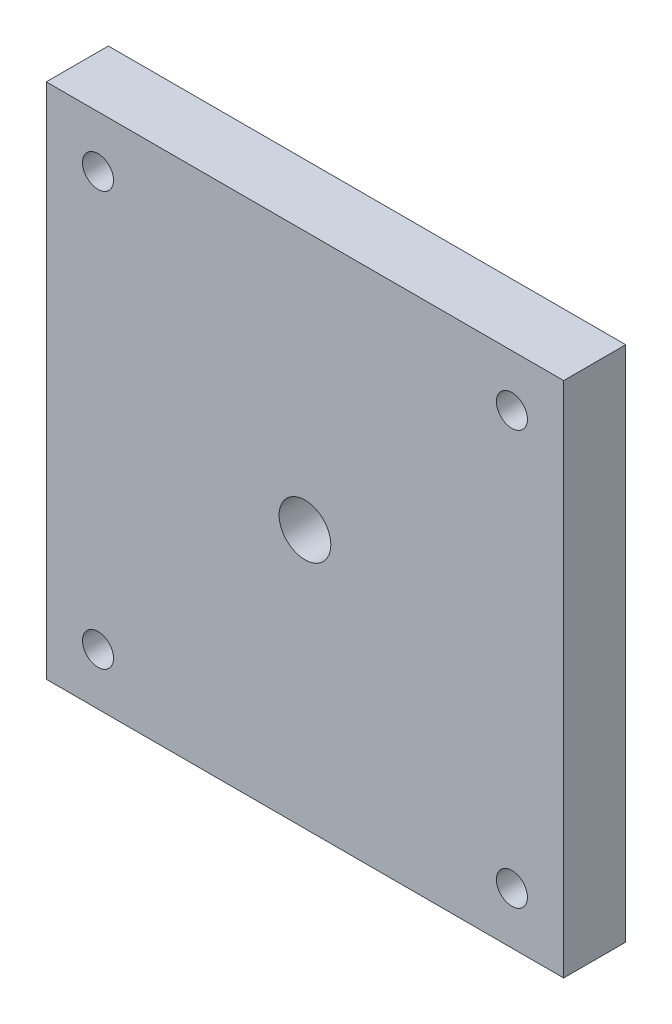
ISO-10303-21;
HEADER;
FILE_DESCRIPTION(('STEP AP214'),'2;1');
FILE_NAME('part.step','',(''),(''),'','','');
FILE_SCHEMA(('AUTOMOTIVE_DESIGN { 1 0 10303 214 1 1 1 1 }'));
ENDSEC;
DATA;
#1=APPLICATION_CONTEXT('core data for automotive mechanical design processes');
#2=APPLICATION_PROTOCOL_DEFINITION('international standard','automotive_design',2000,#1);
#3=PRODUCT_CONTEXT('',#1,'mechanical');
#4=PRODUCT('Part','Part','',(#3));
#5=PRODUCT_RELATED_PRODUCT_CATEGORY('part','',(#4));
#6=PRODUCT_DEFINITION_FORMATION('','',#4);
#7=PRODUCT_DEFINITION_CONTEXT('part definition',#1,'design');
#8=PRODUCT_DEFINITION('design','',#6,#7);
#9=PRODUCT_DEFINITION_SHAPE('','',#8);
#10=(LENGTH_UNIT() NAMED_UNIT(*) SI_UNIT(.MILLI.,.METRE.));
#11=(NAMED_UNIT(*) PLANE_ANGLE_UNIT() SI_UNIT($,.RADIAN.));
#12=(NAMED_UNIT(*) SI_UNIT($,.STERADIAN.) SOLID_ANGLE_UNIT());
#13=UNCERTAINTY_MEASURE_WITH_UNIT(LENGTH_MEASURE(1.E-05),#10,'distance_accuracy_value','');
#14=(GEOMETRIC_REPRESENTATION_CONTEXT(3) GLOBAL_UNCERTAINTY_ASSIGNED_CONTEXT((#13)) GLOBAL_UNIT_ASSIGNED_CONTEXT((#10,
#11,#12)) REPRESENTATION_CONTEXT('',''));
#15=CARTESIAN_POINT('',(0.,0.,0.));
#16=DIRECTION('',(0.,0.,1.));
#17=DIRECTION('',(1.,0.,0.));
#18=AXIS2_PLACEMENT_3D('',#15,#16,#17);
#19=CARTESIAN_POINT('',(0.,0.,6.));
#20=DIRECTION('',(0.,0.,1.));
#21=DIRECTION('',(1.,0.,0.));
#22=AXIS2_PLACEMENT_3D('',#19,#20,#21);
#23=PLANE('',#22);
#24=CARTESIAN_POINT('',(20.,-20.,6.));
#25=DIRECTION('',(0.,0.,1.));
#26=DIRECTION('',(1.,0.,0.));
#27=AXIS2_PLACEMENT_3D('',#24,#25,#26);
#28=CIRCLE('',#27,1.5);
#29=CARTESIAN_POINT('',(21.5,-20.,6.));
#30=VERTEX_POINT('',#29);
#31=EDGE_CURVE('E128',#30,#30,#28,.T.);
#32=ORIENTED_EDGE('',*,*,#31,.F.);
#33=EDGE_LOOP('',(#32));
#34=FACE_BOUND('',#33,.T.);
#35=CARTESIAN_POINT('',(-20.,20.,6.));
#36=DIRECTION('',(0.,0.,1.));
#37=DIRECTION('',(1.,0.,0.));
#38=AXIS2_PLACEMENT_3D('',#35,#36,#37);
#39=CIRCLE('',#38,1.5);
#40=CARTESIAN_POINT('',(-18.5,20.,6.));
#41=VERTEX_POINT('',#40);
#42=EDGE_CURVE('E116',#41,#41,#39,.T.);
#43=ORIENTED_EDGE('',*,*,#42,.F.);
#44=EDGE_LOOP('',(#43));
#45=FACE_BOUND('',#44,.T.);
#46=DIRECTION('',(0.,-1.,0.));
#47=VECTOR('',#46,1.);
#48=CARTESIAN_POINT('',(-25.,25.,6.));
#49=LINE('',#48,#47);
#50=CARTESIAN_POINT('',(-25.,25.,6.));
#51=VERTEX_POINT('',#50);
#52=CARTESIAN_POINT('',(-25.,-25.,6.));
#53=VERTEX_POINT('',#52);
#54=EDGE_CURVE('E86',#51,#53,#49,.T.);
#55=ORIENTED_EDGE('',*,*,#54,.T.);
#56=DIRECTION('',(1.,0.,0.));
#57=VECTOR('',#56,1.);
#58=CARTESIAN_POINT('',(-25.,-25.,6.));
#59=LINE('',#58,#57);
#60=CARTESIAN_POINT('',(25.,-25.,6.));
#61=VERTEX_POINT('',#60);
#62=EDGE_CURVE('E81',#53,#61,#59,.T.);
#63=ORIENTED_EDGE('',*,*,#62,.T.);
#64=DIRECTION('',(0.,1.,0.));
#65=VECTOR('',#64,1.);
#66=CARTESIAN_POINT('',(25.,25.,6.));
#67=LINE('',#66,#65);
#68=CARTESIAN_POINT('',(25.,25.,6.));
#69=VERTEX_POINT('',#68);
#70=EDGE_CURVE('E84',#61,#69,#67,.T.);
#71=ORIENTED_EDGE('',*,*,#70,.T.);
#72=DIRECTION('',(-1.,0.,0.));
#73=VECTOR('',#72,1.);
#74=CARTESIAN_POINT('',(-25.,25.,6.));
#75=LINE('',#74,#73);
#76=EDGE_CURVE('E51',#69,#51,#75,.T.);
#77=ORIENTED_EDGE('',*,*,#76,.T.);
#78=EDGE_LOOP('',(#55,#63,#71,#77));
#79=FACE_BOUND('',#78,.T.);
#80=CARTESIAN_POINT('',(0.,0.,6.));
#81=DIRECTION('',(0.,0.,1.));
#82=DIRECTION('',(1.,0.,0.));
#83=AXIS2_PLACEMENT_3D('',#80,#81,#82);
#84=CIRCLE('',#83,2.5);
#85=CARTESIAN_POINT('',(2.5,0.,6.));
#86=VERTEX_POINT('',#85);
#87=EDGE_CURVE('E101',#86,#86,#84,.T.);
#88=ORIENTED_EDGE('',*,*,#87,.F.);
#89=EDGE_LOOP('',(#88));
#90=FACE_BOUND('',#89,.T.);
#91=CARTESIAN_POINT('',(20.,20.,6.));
#92=DIRECTION('',(0.,0.,1.));
#93=DIRECTION('',(-1.,0.,0.));
#94=AXIS2_PLACEMENT_3D('',#91,#92,#93);
#95=CIRCLE('',#94,1.5);
#96=CARTESIAN_POINT('',(18.5,20.,6.));
#97=VERTEX_POINT('',#96);
#98=EDGE_CURVE('E122',#97,#97,#95,.T.);
#99=ORIENTED_EDGE('',*,*,#98,.F.);
#100=EDGE_LOOP('',(#99));
#101=FACE_BOUND('',#100,.T.);
#102=CARTESIAN_POINT('',(-20.,-20.,6.));
#103=DIRECTION('',(0.,0.,1.));
#104=DIRECTION('',(-1.,0.,0.));
#105=AXIS2_PLACEMENT_3D('',#102,#103,#104);
#106=CIRCLE('',#105,1.5);
#107=CARTESIAN_POINT('',(-21.5,-20.,6.));
#108=VERTEX_POINT('',#107);
#109=EDGE_CURVE('E134',#108,#108,#106,.T.);
#110=ORIENTED_EDGE('',*,*,#109,.F.);
#111=EDGE_LOOP('',(#110));
#112=FACE_BOUND('',#111,.T.);
#113=ADVANCED_FACE('F34',(#34,#45,#79,#90,#101,#112),#23,.T.);
#114=CARTESIAN_POINT('',(0.,0.,0.));
#115=DIRECTION('',(0.,0.,1.));
#116=DIRECTION('',(1.,0.,0.));
#117=AXIS2_PLACEMENT_3D('',#114,#115,#116);
#118=PLANE('',#117);
#119=CARTESIAN_POINT('',(20.,-20.,0.));
#120=DIRECTION('',(0.,0.,1.));
#121=DIRECTION('',(1.,0.,0.));
#122=AXIS2_PLACEMENT_3D('',#119,#120,#121);
#123=CIRCLE('',#122,1.5);
#124=CARTESIAN_POINT('',(21.5,-20.,0.));
#125=VERTEX_POINT('',#124);
#126=EDGE_CURVE('E131',#125,#125,#123,.T.);
#127=ORIENTED_EDGE('',*,*,#126,.T.);
#128=EDGE_LOOP('',(#127));
#129=FACE_BOUND('',#128,.T.);
#130=CARTESIAN_POINT('',(-20.,20.,0.));
#131=DIRECTION('',(0.,0.,1.));
#132=DIRECTION('',(1.,0.,0.));
#133=AXIS2_PLACEMENT_3D('',#130,#131,#132);
#134=CIRCLE('',#133,1.5);
#135=CARTESIAN_POINT('',(-18.5,20.,0.));
#136=VERTEX_POINT('',#135);
#137=EDGE_CURVE('E119',#136,#136,#134,.T.);
#138=ORIENTED_EDGE('',*,*,#137,.T.);
#139=EDGE_LOOP('',(#138));
#140=FACE_BOUND('',#139,.T.);
#141=DIRECTION('',(0.,-1.,0.));
#142=VECTOR('',#141,1.);
#143=CARTESIAN_POINT('',(-25.,25.,0.));
#144=LINE('',#143,#142);
#145=CARTESIAN_POINT('',(-25.,25.,0.));
#146=VERTEX_POINT('',#145);
#147=CARTESIAN_POINT('',(-25.,-25.,0.));
#148=VERTEX_POINT('',#147);
#149=EDGE_CURVE('E98',#146,#148,#144,.T.);
#150=ORIENTED_EDGE('',*,*,#149,.F.);
#151=DIRECTION('',(-1.,0.,0.));
#152=VECTOR('',#151,1.);
#153=CARTESIAN_POINT('',(-25.,25.,0.));
#154=LINE('',#153,#152);
#155=CARTESIAN_POINT('',(25.,25.,0.));
#156=VERTEX_POINT('',#155);
#157=EDGE_CURVE('E74',#156,#146,#154,.T.);
#158=ORIENTED_EDGE('',*,*,#157,.F.);
#159=DIRECTION('',(0.,1.,0.));
#160=VECTOR('',#159,1.);
#161=CARTESIAN_POINT('',(25.,25.,0.));
#162=LINE('',#161,#160);
#163=CARTESIAN_POINT('',(25.,-25.,0.));
#164=VERTEX_POINT('',#163);
#165=EDGE_CURVE('E68',#164,#156,#162,.T.);
#166=ORIENTED_EDGE('',*,*,#165,.F.);
#167=DIRECTION('',(1.,0.,0.));
#168=VECTOR('',#167,1.);
#169=CARTESIAN_POINT('',(-25.,-25.,0.));
#170=LINE('',#169,#168);
#171=EDGE_CURVE('E90',#148,#164,#170,.T.);
#172=ORIENTED_EDGE('',*,*,#171,.F.);
#173=EDGE_LOOP('',(#150,#158,#166,#172));
#174=FACE_BOUND('',#173,.T.);
#175=CARTESIAN_POINT('',(0.,0.,0.));
#176=DIRECTION('',(0.,0.,1.));
#177=DIRECTION('',(1.,0.,0.));
#178=AXIS2_PLACEMENT_3D('',#175,#176,#177);
#179=CIRCLE('',#178,2.5);
#180=CARTESIAN_POINT('',(2.5,0.,0.));
#181=VERTEX_POINT('',#180);
#182=EDGE_CURVE('E113',#181,#181,#179,.T.);
#183=ORIENTED_EDGE('',*,*,#182,.T.);
#184=EDGE_LOOP('',(#183));
#185=FACE_BOUND('',#184,.T.);
#186=CARTESIAN_POINT('',(20.,20.,0.));
#187=DIRECTION('',(0.,0.,1.));
#188=DIRECTION('',(-1.,0.,0.));
#189=AXIS2_PLACEMENT_3D('',#186,#187,#188);
#190=CIRCLE('',#189,1.5);
#191=CARTESIAN_POINT('',(18.5,20.,0.));
#192=VERTEX_POINT('',#191);
#193=EDGE_CURVE('E125',#192,#192,#190,.T.);
#194=ORIENTED_EDGE('',*,*,#193,.T.);
#195=EDGE_LOOP('',(#194));
#196=FACE_BOUND('',#195,.T.);
#197=CARTESIAN_POINT('',(-20.,-20.,0.));
#198=DIRECTION('',(0.,0.,1.));
#199=DIRECTION('',(-1.,0.,0.));
#200=AXIS2_PLACEMENT_3D('',#197,#198,#199);
#201=CIRCLE('',#200,1.5);
#202=CARTESIAN_POINT('',(-21.5,-20.,0.));
#203=VERTEX_POINT('',#202);
#204=EDGE_CURVE('E137',#203,#203,#201,.T.);
#205=ORIENTED_EDGE('',*,*,#204,.T.);
#206=EDGE_LOOP('',(#205));
#207=FACE_BOUND('',#206,.T.);
#208=ADVANCED_FACE('F109',(#129,#140,#174,#185,#196,#207),#118,.F.);
#209=CARTESIAN_POINT('',(-25.,25.,6.));
#210=DIRECTION('',(1.,0.,0.));
#211=DIRECTION('',(0.,1.,0.));
#212=AXIS2_PLACEMENT_3D('',#209,#210,#211);
#213=PLANE('',#212);
#214=ORIENTED_EDGE('',*,*,#149,.T.);
#215=DIRECTION('',(0.,0.,-1.));
#216=VECTOR('',#215,1.);
#217=CARTESIAN_POINT('',(-25.,-25.,6.));
#218=LINE('',#217,#216);
#219=EDGE_CURVE('E11',#53,#148,#218,.T.);
#220=ORIENTED_EDGE('',*,*,#219,.F.);
#221=ORIENTED_EDGE('',*,*,#54,.F.);
#222=DIRECTION('',(0.,0.,-1.));
#223=VECTOR('',#222,1.);
#224=CARTESIAN_POINT('',(-25.,25.,6.));
#225=LINE('',#224,#223);
#226=EDGE_CURVE('E94',#51,#146,#225,.T.);
#227=ORIENTED_EDGE('',*,*,#226,.T.);
#228=EDGE_LOOP('',(#214,#220,#221,#227));
#229=FACE_BOUND('',#228,.T.);
#230=ADVANCED_FACE('F36',(#229),#213,.F.);
#231=CARTESIAN_POINT('',(-25.,-25.,6.));
#232=DIRECTION('',(0.,1.,0.));
#233=DIRECTION('',(0.,0.,1.));
#234=AXIS2_PLACEMENT_3D('',#231,#232,#233);
#235=PLANE('',#234);
#236=ORIENTED_EDGE('',*,*,#171,.T.);
#237=DIRECTION('',(0.,0.,-1.));
#238=VECTOR('',#237,1.);
#239=CARTESIAN_POINT('',(25.,-25.,6.));
#240=LINE('',#239,#238);
#241=EDGE_CURVE('E43',#61,#164,#240,.T.);
#242=ORIENTED_EDGE('',*,*,#241,.F.);
#243=ORIENTED_EDGE('',*,*,#62,.F.);
#244=ORIENTED_EDGE('',*,*,#219,.T.);
#245=EDGE_LOOP('',(#236,#242,#243,#244));
#246=FACE_BOUND('',#245,.T.);
#247=ADVANCED_FACE('F89',(#246),#235,.F.);
#248=CARTESIAN_POINT('',(25.,25.,6.));
#249=DIRECTION('',(-1.,0.,0.));
#250=DIRECTION('',(0.,-1.,0.));
#251=AXIS2_PLACEMENT_3D('',#248,#249,#250);
#252=PLANE('',#251);
#253=ORIENTED_EDGE('',*,*,#165,.T.);
#254=DIRECTION('',(0.,0.,-1.));
#255=VECTOR('',#254,1.);
#256=CARTESIAN_POINT('',(25.,25.,6.));
#257=LINE('',#256,#255);
#258=EDGE_CURVE('E91',#69,#156,#257,.T.);
#259=ORIENTED_EDGE('',*,*,#258,.F.);
#260=ORIENTED_EDGE('',*,*,#70,.F.);
#261=ORIENTED_EDGE('',*,*,#241,.T.);
#262=EDGE_LOOP('',(#253,#259,#260,#261));
#263=FACE_BOUND('',#262,.T.);
#264=ADVANCED_FACE('F92',(#263),#252,.F.);
#265=CARTESIAN_POINT('',(-25.,25.,6.));
#266=DIRECTION('',(0.,-1.,0.));
#267=DIRECTION('',(0.,0.,-1.));
#268=AXIS2_PLACEMENT_3D('',#265,#266,#267);
#269=PLANE('',#268);
#270=ORIENTED_EDGE('',*,*,#157,.T.);
#271=ORIENTED_EDGE('',*,*,#226,.F.);
#272=ORIENTED_EDGE('',*,*,#76,.F.);
#273=ORIENTED_EDGE('',*,*,#258,.T.);
#274=EDGE_LOOP('',(#270,#271,#272,#273));
#275=FACE_BOUND('',#274,.T.);
#276=ADVANCED_FACE('F106',(#275),#269,.F.);
#277=CARTESIAN_POINT('',(0.,0.,6.));
#278=DIRECTION('',(0.,0.,-1.));
#279=DIRECTION('',(-1.,0.,0.));
#280=AXIS2_PLACEMENT_3D('',#277,#278,#279);
#281=CYLINDRICAL_SURFACE('',#280,2.5);
#282=ORIENTED_EDGE('',*,*,#87,.T.);
#283=EDGE_LOOP('',(#282));
#284=FACE_BOUND('',#283,.T.);
#285=ORIENTED_EDGE('',*,*,#182,.F.);
#286=EDGE_LOOP('',(#285));
#287=FACE_BOUND('',#286,.T.);
#288=ADVANCED_FACE('F157',(#284,#287),#281,.F.);
#289=CARTESIAN_POINT('',(-20.,20.,6.));
#290=DIRECTION('',(0.,0.,-1.));
#291=DIRECTION('',(-1.,0.,0.));
#292=AXIS2_PLACEMENT_3D('',#289,#290,#291);
#293=CYLINDRICAL_SURFACE('',#292,1.5);
#294=ORIENTED_EDGE('',*,*,#42,.T.);
#295=EDGE_LOOP('',(#294));
#296=FACE_BOUND('',#295,.T.);
#297=ORIENTED_EDGE('',*,*,#137,.F.);
#298=EDGE_LOOP('',(#297));
#299=FACE_BOUND('',#298,.T.);
#300=ADVANCED_FACE('F203',(#296,#299),#293,.F.);
#301=CARTESIAN_POINT('',(20.,20.,6.));
#302=DIRECTION('',(0.,0.,-1.));
#303=DIRECTION('',(-1.,0.,0.));
#304=AXIS2_PLACEMENT_3D('',#301,#302,#303);
#305=CYLINDRICAL_SURFACE('',#304,1.5);
#306=ORIENTED_EDGE('',*,*,#98,.T.);
#307=EDGE_LOOP('',(#306));
#308=FACE_BOUND('',#307,.T.);
#309=ORIENTED_EDGE('',*,*,#193,.F.);
#310=EDGE_LOOP('',(#309));
#311=FACE_BOUND('',#310,.T.);
#312=ADVANCED_FACE('F211',(#308,#311),#305,.F.);
#313=CARTESIAN_POINT('',(20.,-20.,6.));
#314=DIRECTION('',(0.,0.,-1.));
#315=DIRECTION('',(-1.,0.,0.));
#316=AXIS2_PLACEMENT_3D('',#313,#314,#315);
#317=CYLINDRICAL_SURFACE('',#316,1.5);
#318=ORIENTED_EDGE('',*,*,#31,.T.);
#319=EDGE_LOOP('',(#318));
#320=FACE_BOUND('',#319,.T.);
#321=ORIENTED_EDGE('',*,*,#126,.F.);
#322=EDGE_LOOP('',(#321));
#323=FACE_BOUND('',#322,.T.);
#324=ADVANCED_FACE('F219',(#320,#323),#317,.F.);
#325=CARTESIAN_POINT('',(-20.,-20.,6.));
#326=DIRECTION('',(0.,0.,-1.));
#327=DIRECTION('',(-1.,0.,0.));
#328=AXIS2_PLACEMENT_3D('',#325,#326,#327);
#329=CYLINDRICAL_SURFACE('',#328,1.5);
#330=ORIENTED_EDGE('',*,*,#109,.T.);
#331=EDGE_LOOP('',(#330));
#332=FACE_BOUND('',#331,.T.);
#333=ORIENTED_EDGE('',*,*,#204,.F.);
#334=EDGE_LOOP('',(#333));
#335=FACE_BOUND('',#334,.T.);
#336=ADVANCED_FACE('F143',(#332,#335),#329,.F.);
#337=CLOSED_SHELL('',(#113,#208,#230,#247,#264,#276,#288,#300,#312,#324,#336));
#338=MANIFOLD_SOLID_BREP('B2',#337);
#339=ADVANCED_BREP_SHAPE_REPRESENTATION('',(#18,#338),#14);
#340=SHAPE_DEFINITION_REPRESENTATION(#9,#339);
ENDSEC;
END-ISO-10303-21;
